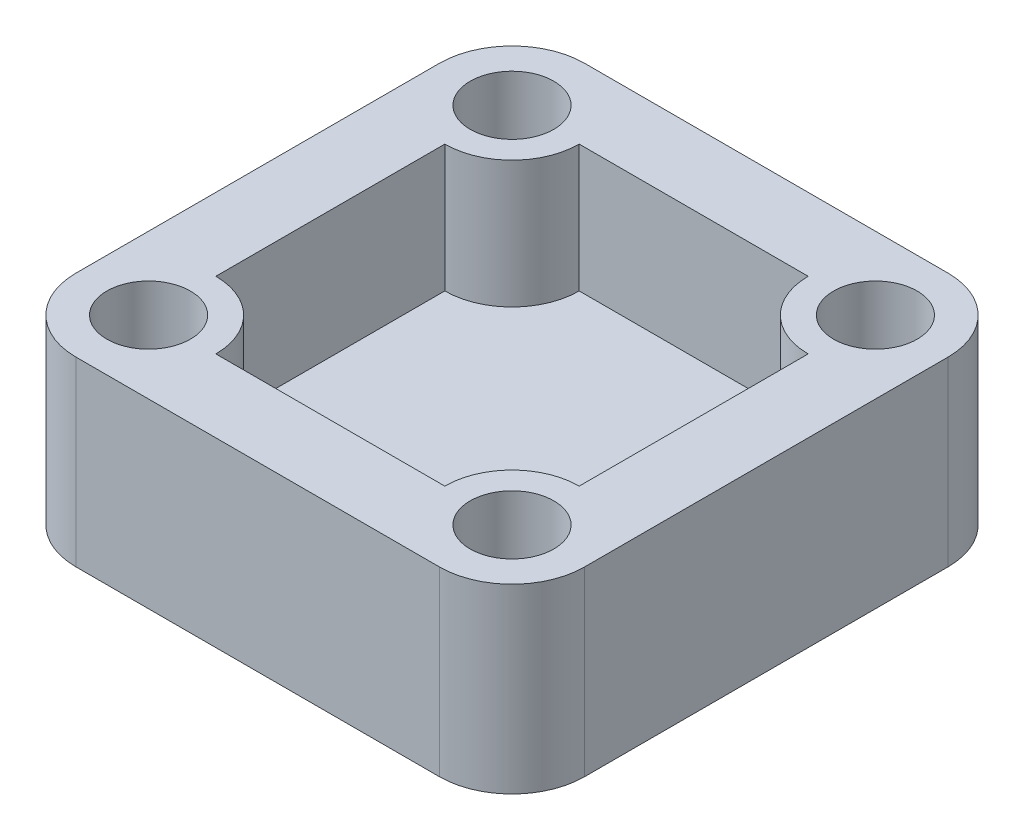
ISO-10303-21;
HEADER;
FILE_DESCRIPTION(('STEP AP214'),'2;1');
FILE_NAME('part.step','',(''),(''),'','','');
FILE_SCHEMA(('AUTOMOTIVE_DESIGN { 1 0 10303 214 1 1 1 1 }'));
ENDSEC;
DATA;
#1=APPLICATION_CONTEXT('core data for automotive mechanical design processes');
#2=APPLICATION_PROTOCOL_DEFINITION('international standard','automotive_design',2000,#1);
#3=PRODUCT_CONTEXT('',#1,'mechanical');
#4=PRODUCT('Part','Part','',(#3));
#5=PRODUCT_RELATED_PRODUCT_CATEGORY('part','',(#4));
#6=PRODUCT_DEFINITION_FORMATION('','',#4);
#7=PRODUCT_DEFINITION_CONTEXT('part definition',#1,'design');
#8=PRODUCT_DEFINITION('design','',#6,#7);
#9=PRODUCT_DEFINITION_SHAPE('','',#8);
#10=(LENGTH_UNIT() NAMED_UNIT(*) SI_UNIT(.MILLI.,.METRE.));
#11=(NAMED_UNIT(*) PLANE_ANGLE_UNIT() SI_UNIT($,.RADIAN.));
#12=(NAMED_UNIT(*) SI_UNIT($,.STERADIAN.) SOLID_ANGLE_UNIT());
#13=UNCERTAINTY_MEASURE_WITH_UNIT(LENGTH_MEASURE(1.E-05),#10,'distance_accuracy_value','');
#14=(GEOMETRIC_REPRESENTATION_CONTEXT(3) GLOBAL_UNCERTAINTY_ASSIGNED_CONTEXT((#13)) GLOBAL_UNIT_ASSIGNED_CONTEXT((#10,
#11,#12)) REPRESENTATION_CONTEXT('',''));
#15=CARTESIAN_POINT('',(0.,0.,0.));
#16=DIRECTION('',(0.,0.,1.));
#17=DIRECTION('',(1.,0.,0.));
#18=AXIS2_PLACEMENT_3D('',#15,#16,#17);
#19=CARTESIAN_POINT('',(-4.99999999999995,1.5,-5.00000000000005));
#20=DIRECTION('',(0.,-1.,0.));
#21=DIRECTION('',(0.,0.,-1.));
#22=AXIS2_PLACEMENT_3D('',#19,#20,#21);
#23=CYLINDRICAL_SURFACE('',#22,2.);
#24=CARTESIAN_POINT('',(-4.99999999999995,0.,-5.00000000000005));
#25=DIRECTION('',(0.,1.,0.));
#26=DIRECTION('',(0.,0.,-1.));
#27=AXIS2_PLACEMENT_3D('',#24,#25,#26);
#28=CIRCLE('',#27,2.);
#29=CARTESIAN_POINT('',(-4.99999999999992,0.,-7.00000000000005));
#30=VERTEX_POINT('',#29);
#31=CARTESIAN_POINT('',(-6.99999999999995,0.,-5.00000000000007));
#32=VERTEX_POINT('',#31);
#33=EDGE_CURVE('E247',#30,#32,#28,.T.);
#34=ORIENTED_EDGE('',*,*,#33,.T.);
#35=DIRECTION('',(0.,-1.,0.));
#36=VECTOR('',#35,1.);
#37=CARTESIAN_POINT('',(-6.99999999999995,1.5,-5.00000000000007));
#38=LINE('',#37,#36);
#39=CARTESIAN_POINT('',(-6.99999999999995,5.,-5.00000000000007));
#40=VERTEX_POINT('',#39);
#41=EDGE_CURVE('E44',#40,#32,#38,.T.);
#42=ORIENTED_EDGE('',*,*,#41,.F.);
#43=CARTESIAN_POINT('',(-4.99999999999995,5.,-5.00000000000005));
#44=DIRECTION('',(0.,1.,0.));
#45=DIRECTION('',(0.,0.,-1.));
#46=AXIS2_PLACEMENT_3D('',#43,#44,#45);
#47=CIRCLE('',#46,2.);
#48=CARTESIAN_POINT('',(-4.99999999999992,5.,-7.00000000000005));
#49=VERTEX_POINT('',#48);
#50=EDGE_CURVE('E229',#49,#40,#47,.T.);
#51=ORIENTED_EDGE('',*,*,#50,.F.);
#52=DIRECTION('',(0.,-1.,0.));
#53=VECTOR('',#52,1.);
#54=CARTESIAN_POINT('',(-4.99999999999992,1.5,-7.00000000000005));
#55=LINE('',#54,#53);
#56=EDGE_CURVE('E11',#49,#30,#55,.T.);
#57=ORIENTED_EDGE('',*,*,#56,.T.);
#58=EDGE_LOOP('',(#34,#42,#51,#57));
#59=FACE_BOUND('',#58,.T.);
#60=ADVANCED_FACE('F37',(#59),#23,.T.);
#61=CARTESIAN_POINT('',(-7.,1.5,0.));
#62=DIRECTION('',(1.,0.,0.));
#63=DIRECTION('',(0.,0.,-1.));
#64=AXIS2_PLACEMENT_3D('',#61,#62,#63);
#65=PLANE('',#64);
#66=DIRECTION('',(0.,0.,1.));
#67=VECTOR('',#66,1.);
#68=CARTESIAN_POINT('',(-7.,0.,0.));
#69=LINE('',#68,#67);
#70=CARTESIAN_POINT('',(-7.00000000000003,0.,4.99999999999995));
#71=VERTEX_POINT('',#70);
#72=EDGE_CURVE('E250',#32,#71,#69,.T.);
#73=ORIENTED_EDGE('',*,*,#72,.T.);
#74=DIRECTION('',(0.,-1.,0.));
#75=VECTOR('',#74,1.);
#76=CARTESIAN_POINT('',(-7.00000000000003,1.5,4.99999999999995));
#77=LINE('',#76,#75);
#78=CARTESIAN_POINT('',(-7.00000000000003,5.,4.99999999999995));
#79=VERTEX_POINT('',#78);
#80=EDGE_CURVE('E278',#79,#71,#77,.T.);
#81=ORIENTED_EDGE('',*,*,#80,.F.);
#82=DIRECTION('',(0.,0.,1.));
#83=VECTOR('',#82,1.);
#84=CARTESIAN_POINT('',(-7.,5.,0.));
#85=LINE('',#84,#83);
#86=EDGE_CURVE('E232',#40,#79,#85,.T.);
#87=ORIENTED_EDGE('',*,*,#86,.F.);
#88=ORIENTED_EDGE('',*,*,#41,.T.);
#89=EDGE_LOOP('',(#73,#81,#87,#88));
#90=FACE_BOUND('',#89,.T.);
#91=ADVANCED_FACE('F283',(#90),#65,.F.);
#92=CARTESIAN_POINT('',(-5.00000000000003,1.5,4.99999999999996));
#93=DIRECTION('',(0.,-1.,0.));
#94=DIRECTION('',(0.,0.,-1.));
#95=AXIS2_PLACEMENT_3D('',#92,#93,#94);
#96=CYLINDRICAL_SURFACE('',#95,2.);
#97=CARTESIAN_POINT('',(-5.00000000000003,0.,4.99999999999996));
#98=DIRECTION('',(0.,1.,0.));
#99=DIRECTION('',(0.,0.,-1.));
#100=AXIS2_PLACEMENT_3D('',#97,#98,#99);
#101=CIRCLE('',#100,2.);
#102=CARTESIAN_POINT('',(-5.00000000000004,0.,6.99999999999996));
#103=VERTEX_POINT('',#102);
#104=EDGE_CURVE('E252',#71,#103,#101,.T.);
#105=ORIENTED_EDGE('',*,*,#104,.T.);
#106=DIRECTION('',(0.,-1.,0.));
#107=VECTOR('',#106,1.);
#108=CARTESIAN_POINT('',(-5.00000000000004,1.5,6.99999999999996));
#109=LINE('',#108,#107);
#110=CARTESIAN_POINT('',(-5.00000000000004,5.,6.99999999999996));
#111=VERTEX_POINT('',#110);
#112=EDGE_CURVE('E275',#111,#103,#109,.T.);
#113=ORIENTED_EDGE('',*,*,#112,.F.);
#114=CARTESIAN_POINT('',(-5.00000000000003,5.,4.99999999999996));
#115=DIRECTION('',(0.,1.,0.));
#116=DIRECTION('',(0.,0.,-1.));
#117=AXIS2_PLACEMENT_3D('',#114,#115,#116);
#118=CIRCLE('',#117,2.);
#119=EDGE_CURVE('E235',#79,#111,#118,.T.);
#120=ORIENTED_EDGE('',*,*,#119,.F.);
#121=ORIENTED_EDGE('',*,*,#80,.T.);
#122=EDGE_LOOP('',(#105,#113,#120,#121));
#123=FACE_BOUND('',#122,.T.);
#124=ADVANCED_FACE('F299',(#123),#96,.T.);
#125=CARTESIAN_POINT('',(0.,1.5,7.));
#126=DIRECTION('',(0.,0.,-1.));
#127=DIRECTION('',(-1.,0.,0.));
#128=AXIS2_PLACEMENT_3D('',#125,#126,#127);
#129=PLANE('',#128);
#130=DIRECTION('',(1.,0.,0.));
#131=VECTOR('',#130,1.);
#132=CARTESIAN_POINT('',(0.,0.,7.));
#133=LINE('',#132,#131);
#134=CARTESIAN_POINT('',(4.99999999999997,0.,7.00000000000001));
#135=VERTEX_POINT('',#134);
#136=EDGE_CURVE('E255',#103,#135,#133,.T.);
#137=ORIENTED_EDGE('',*,*,#136,.T.);
#138=DIRECTION('',(0.,-1.,0.));
#139=VECTOR('',#138,1.);
#140=CARTESIAN_POINT('',(4.99999999999997,1.5,7.00000000000001));
#141=LINE('',#140,#139);
#142=CARTESIAN_POINT('',(4.99999999999997,5.,7.00000000000001));
#143=VERTEX_POINT('',#142);
#144=EDGE_CURVE('E272',#143,#135,#141,.T.);
#145=ORIENTED_EDGE('',*,*,#144,.F.);
#146=DIRECTION('',(1.,0.,0.));
#147=VECTOR('',#146,1.);
#148=CARTESIAN_POINT('',(0.,5.,7.));
#149=LINE('',#148,#147);
#150=EDGE_CURVE('E238',#111,#143,#149,.T.);
#151=ORIENTED_EDGE('',*,*,#150,.F.);
#152=ORIENTED_EDGE('',*,*,#112,.T.);
#153=EDGE_LOOP('',(#137,#145,#151,#152));
#154=FACE_BOUND('',#153,.T.);
#155=ADVANCED_FACE('F302',(#154),#129,.F.);
#156=CARTESIAN_POINT('',(4.99999999999998,1.5,5.00000000000001));
#157=DIRECTION('',(0.,-1.,0.));
#158=DIRECTION('',(0.,0.,-1.));
#159=AXIS2_PLACEMENT_3D('',#156,#157,#158);
#160=CYLINDRICAL_SURFACE('',#159,2.);
#161=CARTESIAN_POINT('',(4.99999999999998,0.,5.00000000000001));
#162=DIRECTION('',(0.,1.,0.));
#163=DIRECTION('',(0.,0.,-1.));
#164=AXIS2_PLACEMENT_3D('',#161,#162,#163);
#165=CIRCLE('',#164,2.);
#166=CARTESIAN_POINT('',(6.99999999999998,0.,5.00000000000002));
#167=VERTEX_POINT('',#166);
#168=EDGE_CURVE('E257',#135,#167,#165,.T.);
#169=ORIENTED_EDGE('',*,*,#168,.T.);
#170=DIRECTION('',(0.,-1.,0.));
#171=VECTOR('',#170,1.);
#172=CARTESIAN_POINT('',(6.99999999999998,1.5,5.00000000000002));
#173=LINE('',#172,#171);
#174=CARTESIAN_POINT('',(6.99999999999998,5.,5.00000000000002));
#175=VERTEX_POINT('',#174);
#176=EDGE_CURVE('E269',#175,#167,#173,.T.);
#177=ORIENTED_EDGE('',*,*,#176,.F.);
#178=CARTESIAN_POINT('',(4.99999999999998,5.,5.00000000000001));
#179=DIRECTION('',(0.,1.,0.));
#180=DIRECTION('',(0.,0.,-1.));
#181=AXIS2_PLACEMENT_3D('',#178,#179,#180);
#182=CIRCLE('',#181,2.);
#183=EDGE_CURVE('E241',#143,#175,#182,.T.);
#184=ORIENTED_EDGE('',*,*,#183,.F.);
#185=ORIENTED_EDGE('',*,*,#144,.T.);
#186=EDGE_LOOP('',(#169,#177,#184,#185));
#187=FACE_BOUND('',#186,.T.);
#188=ADVANCED_FACE('F306',(#187),#160,.T.);
#189=CARTESIAN_POINT('',(7.,1.5,0.));
#190=DIRECTION('',(-1.,0.,0.));
#191=DIRECTION('',(0.,0.,1.));
#192=AXIS2_PLACEMENT_3D('',#189,#190,#191);
#193=PLANE('',#192);
#194=DIRECTION('',(0.,0.,-1.));
#195=VECTOR('',#194,1.);
#196=CARTESIAN_POINT('',(7.,0.,0.));
#197=LINE('',#196,#195);
#198=CARTESIAN_POINT('',(7.,0.,-5.));
#199=VERTEX_POINT('',#198);
#200=EDGE_CURVE('E260',#167,#199,#197,.T.);
#201=ORIENTED_EDGE('',*,*,#200,.T.);
#202=DIRECTION('',(0.,-1.,0.));
#203=VECTOR('',#202,1.);
#204=CARTESIAN_POINT('',(7.,1.5,-5.));
#205=LINE('',#204,#203);
#206=CARTESIAN_POINT('',(7.,5.,-5.));
#207=VERTEX_POINT('',#206);
#208=EDGE_CURVE('E267',#207,#199,#205,.T.);
#209=ORIENTED_EDGE('',*,*,#208,.F.);
#210=DIRECTION('',(0.,0.,-1.));
#211=VECTOR('',#210,1.);
#212=CARTESIAN_POINT('',(7.,5.,0.));
#213=LINE('',#212,#211);
#214=EDGE_CURVE('E244',#175,#207,#213,.T.);
#215=ORIENTED_EDGE('',*,*,#214,.F.);
#216=ORIENTED_EDGE('',*,*,#176,.T.);
#217=EDGE_LOOP('',(#201,#209,#215,#216));
#218=FACE_BOUND('',#217,.T.);
#219=ADVANCED_FACE('F308',(#218),#193,.F.);
#220=CARTESIAN_POINT('',(5.,1.5,-5.));
#221=DIRECTION('',(0.,-1.,0.));
#222=DIRECTION('',(0.,0.,-1.));
#223=AXIS2_PLACEMENT_3D('',#220,#221,#222);
#224=CYLINDRICAL_SURFACE('',#223,2.);
#225=CARTESIAN_POINT('',(5.,0.,-5.));
#226=DIRECTION('',(0.,1.,0.));
#227=DIRECTION('',(0.,0.,-1.));
#228=AXIS2_PLACEMENT_3D('',#225,#226,#227);
#229=CIRCLE('',#228,2.);
#230=CARTESIAN_POINT('',(5.,0.,-7.));
#231=VERTEX_POINT('',#230);
#232=EDGE_CURVE('E59',#199,#231,#229,.T.);
#233=ORIENTED_EDGE('',*,*,#232,.T.);
#234=DIRECTION('',(0.,-1.,0.));
#235=VECTOR('',#234,1.);
#236=CARTESIAN_POINT('',(5.,1.5,-7.));
#237=LINE('',#236,#235);
#238=CARTESIAN_POINT('',(5.,5.,-7.));
#239=VERTEX_POINT('',#238);
#240=EDGE_CURVE('E265',#239,#231,#237,.T.);
#241=ORIENTED_EDGE('',*,*,#240,.F.);
#242=CARTESIAN_POINT('',(5.,5.,-5.));
#243=DIRECTION('',(0.,1.,0.));
#244=DIRECTION('',(0.,0.,-1.));
#245=AXIS2_PLACEMENT_3D('',#242,#243,#244);
#246=CIRCLE('',#245,2.);
#247=EDGE_CURVE('E166',#207,#239,#246,.T.);
#248=ORIENTED_EDGE('',*,*,#247,.F.);
#249=ORIENTED_EDGE('',*,*,#208,.T.);
#250=EDGE_LOOP('',(#233,#241,#248,#249));
#251=FACE_BOUND('',#250,.T.);
#252=ADVANCED_FACE('F309',(#251),#224,.T.);
#253=CARTESIAN_POINT('',(0.,1.5,-7.));
#254=DIRECTION('',(0.,0.,1.));
#255=DIRECTION('',(1.,0.,0.));
#256=AXIS2_PLACEMENT_3D('',#253,#254,#255);
#257=PLANE('',#256);
#258=DIRECTION('',(-1.,0.,0.));
#259=VECTOR('',#258,1.);
#260=CARTESIAN_POINT('',(0.,0.,-7.));
#261=LINE('',#260,#259);
#262=EDGE_CURVE('E263',#231,#30,#261,.T.);
#263=ORIENTED_EDGE('',*,*,#262,.T.);
#264=ORIENTED_EDGE('',*,*,#56,.F.);
#265=DIRECTION('',(-1.,0.,0.));
#266=VECTOR('',#265,1.);
#267=CARTESIAN_POINT('',(0.,5.,-7.));
#268=LINE('',#267,#266);
#269=EDGE_CURVE('E226',#239,#49,#268,.T.);
#270=ORIENTED_EDGE('',*,*,#269,.F.);
#271=ORIENTED_EDGE('',*,*,#240,.T.);
#272=EDGE_LOOP('',(#263,#264,#270,#271));
#273=FACE_BOUND('',#272,.T.);
#274=ADVANCED_FACE('F292',(#273),#257,.F.);
#275=CARTESIAN_POINT('',(-4.99999999999995,0.,-5.00000000000005));
#276=DIRECTION('',(0.,-1.,0.));
#277=DIRECTION('',(0.,0.,-1.));
#278=AXIS2_PLACEMENT_3D('',#275,#276,#277);
#279=PLANE('',#278);
#280=CARTESIAN_POINT('',(-5.,0.,-4.99999999999972));
#281=DIRECTION('',(0.,1.,0.));
#282=DIRECTION('',(0.,0.,1.));
#283=AXIS2_PLACEMENT_3D('',#280,#281,#282);
#284=CIRCLE('',#283,1.15);
#285=CARTESIAN_POINT('',(-5.,0.,-3.84999999999972));
#286=VERTEX_POINT('',#285);
#287=EDGE_CURVE('E507',#286,#286,#284,.T.);
#288=ORIENTED_EDGE('',*,*,#287,.T.);
#289=EDGE_LOOP('',(#288));
#290=FACE_BOUND('',#289,.T.);
#291=CARTESIAN_POINT('',(-4.99999999999972,0.,5.00000000000027));
#292=DIRECTION('',(0.,1.,0.));
#293=DIRECTION('',(0.,0.,1.));
#294=AXIS2_PLACEMENT_3D('',#291,#292,#293);
#295=CIRCLE('',#294,1.15);
#296=CARTESIAN_POINT('',(-4.99999999999972,0.,6.15000000000027));
#297=VERTEX_POINT('',#296);
#298=EDGE_CURVE('E515',#297,#297,#295,.T.);
#299=ORIENTED_EDGE('',*,*,#298,.T.);
#300=EDGE_LOOP('',(#299));
#301=FACE_BOUND('',#300,.T.);
#302=CARTESIAN_POINT('',(5.00000000000027,0.,4.99999999999999));
#303=DIRECTION('',(0.,1.,0.));
#304=DIRECTION('',(0.,0.,1.));
#305=AXIS2_PLACEMENT_3D('',#302,#303,#304);
#306=CIRCLE('',#305,1.15);
#307=CARTESIAN_POINT('',(5.00000000000027,0.,6.15));
#308=VERTEX_POINT('',#307);
#309=EDGE_CURVE('E521',#308,#308,#306,.T.);
#310=ORIENTED_EDGE('',*,*,#309,.T.);
#311=EDGE_LOOP('',(#310));
#312=FACE_BOUND('',#311,.T.);
#313=CARTESIAN_POINT('',(5.,0.,-5.));
#314=DIRECTION('',(0.,1.,0.));
#315=DIRECTION('',(0.,0.,1.));
#316=AXIS2_PLACEMENT_3D('',#313,#314,#315);
#317=CIRCLE('',#316,1.15);
#318=CARTESIAN_POINT('',(5.,0.,-3.85));
#319=VERTEX_POINT('',#318);
#320=EDGE_CURVE('E190',#319,#319,#317,.T.);
#321=ORIENTED_EDGE('',*,*,#320,.T.);
#322=EDGE_LOOP('',(#321));
#323=FACE_BOUND('',#322,.T.);
#324=ORIENTED_EDGE('',*,*,#33,.F.);
#325=ORIENTED_EDGE('',*,*,#262,.F.);
#326=ORIENTED_EDGE('',*,*,#232,.F.);
#327=ORIENTED_EDGE('',*,*,#200,.F.);
#328=ORIENTED_EDGE('',*,*,#168,.F.);
#329=ORIENTED_EDGE('',*,*,#136,.F.);
#330=ORIENTED_EDGE('',*,*,#104,.F.);
#331=ORIENTED_EDGE('',*,*,#72,.F.);
#332=EDGE_LOOP('',(#324,#325,#326,#327,#328,#329,#330,#331));
#333=FACE_BOUND('',#332,.T.);
#334=ADVANCED_FACE('F295',(#290,#301,#312,#323,#333),#279,.T.);
#335=CARTESIAN_POINT('',(5.,5.,-5.));
#336=DIRECTION('',(0.,-1.,0.));
#337=DIRECTION('',(0.,0.,-1.));
#338=AXIS2_PLACEMENT_3D('',#335,#336,#337);
#339=PLANE('',#338);
#340=CARTESIAN_POINT('',(-5.,5.,-4.99999999999972));
#341=DIRECTION('',(0.,1.,0.));
#342=DIRECTION('',(0.,0.,1.));
#343=AXIS2_PLACEMENT_3D('',#340,#341,#342);
#344=CIRCLE('',#343,1.15);
#345=CARTESIAN_POINT('',(-5.,5.,-3.84999999999972));
#346=VERTEX_POINT('',#345);
#347=EDGE_CURVE('E510',#346,#346,#344,.T.);
#348=ORIENTED_EDGE('',*,*,#347,.F.);
#349=EDGE_LOOP('',(#348));
#350=FACE_BOUND('',#349,.T.);
#351=CARTESIAN_POINT('',(-4.99999999999972,5.,5.00000000000027));
#352=DIRECTION('',(0.,1.,0.));
#353=DIRECTION('',(0.,0.,1.));
#354=AXIS2_PLACEMENT_3D('',#351,#352,#353);
#355=CIRCLE('',#354,1.15);
#356=CARTESIAN_POINT('',(-4.99999999999972,5.,6.15000000000027));
#357=VERTEX_POINT('',#356);
#358=EDGE_CURVE('E512',#357,#357,#355,.T.);
#359=ORIENTED_EDGE('',*,*,#358,.F.);
#360=EDGE_LOOP('',(#359));
#361=FACE_BOUND('',#360,.T.);
#362=CARTESIAN_POINT('',(5.00000000000027,5.,4.99999999999999));
#363=DIRECTION('',(0.,1.,0.));
#364=DIRECTION('',(0.,0.,1.));
#365=AXIS2_PLACEMENT_3D('',#362,#363,#364);
#366=CIRCLE('',#365,1.15);
#367=CARTESIAN_POINT('',(5.00000000000027,5.,6.15));
#368=VERTEX_POINT('',#367);
#369=EDGE_CURVE('E518',#368,#368,#366,.T.);
#370=ORIENTED_EDGE('',*,*,#369,.F.);
#371=EDGE_LOOP('',(#370));
#372=FACE_BOUND('',#371,.T.);
#373=CARTESIAN_POINT('',(5.,5.,-5.));
#374=DIRECTION('',(0.,1.,0.));
#375=DIRECTION('',(0.,0.,1.));
#376=AXIS2_PLACEMENT_3D('',#373,#374,#375);
#377=CIRCLE('',#376,1.15);
#378=CARTESIAN_POINT('',(5.,5.,-3.85));
#379=VERTEX_POINT('',#378);
#380=EDGE_CURVE('E524',#379,#379,#377,.T.);
#381=ORIENTED_EDGE('',*,*,#380,.F.);
#382=EDGE_LOOP('',(#381));
#383=FACE_BOUND('',#382,.T.);
#384=ORIENTED_EDGE('',*,*,#247,.T.);
#385=ORIENTED_EDGE('',*,*,#269,.T.);
#386=ORIENTED_EDGE('',*,*,#50,.T.);
#387=ORIENTED_EDGE('',*,*,#86,.T.);
#388=ORIENTED_EDGE('',*,*,#119,.T.);
#389=ORIENTED_EDGE('',*,*,#150,.T.);
#390=ORIENTED_EDGE('',*,*,#183,.T.);
#391=ORIENTED_EDGE('',*,*,#214,.T.);
#392=EDGE_LOOP('',(#384,#385,#386,#387,#388,#389,#390,#391));
#393=FACE_BOUND('',#392,.T.);
#394=CARTESIAN_POINT('',(5.,5.,-5.));
#395=DIRECTION('',(0.,-1.,0.));
#396=DIRECTION('',(0.,0.,1.));
#397=AXIS2_PLACEMENT_3D('',#394,#395,#396);
#398=CIRCLE('',#397,1.85);
#399=CARTESIAN_POINT('',(5.,5.,-3.15));
#400=VERTEX_POINT('',#399);
#401=CARTESIAN_POINT('',(3.14999999999999,5.,-5.));
#402=VERTEX_POINT('',#401);
#403=EDGE_CURVE('E150',#400,#402,#398,.T.);
#404=ORIENTED_EDGE('',*,*,#403,.F.);
#405=DIRECTION('',(0.,0.,-1.));
#406=VECTOR('',#405,1.);
#407=CARTESIAN_POINT('',(5.,5.,0.));
#408=LINE('',#407,#406);
#409=CARTESIAN_POINT('',(5.,5.,3.15000000000002));
#410=VERTEX_POINT('',#409);
#411=EDGE_CURVE('E186',#410,#400,#408,.T.);
#412=ORIENTED_EDGE('',*,*,#411,.F.);
#413=CARTESIAN_POINT('',(4.99999999999998,5.,5.00000000000001));
#414=DIRECTION('',(0.,-1.,0.));
#415=DIRECTION('',(0.,0.,1.));
#416=AXIS2_PLACEMENT_3D('',#413,#414,#415);
#417=CIRCLE('',#416,1.85);
#418=CARTESIAN_POINT('',(3.15,5.,5.));
#419=VERTEX_POINT('',#418);
#420=EDGE_CURVE('E183',#419,#410,#417,.T.);
#421=ORIENTED_EDGE('',*,*,#420,.F.);
#422=DIRECTION('',(1.,0.,0.));
#423=VECTOR('',#422,1.);
#424=CARTESIAN_POINT('',(0.,5.,5.));
#425=LINE('',#424,#423);
#426=CARTESIAN_POINT('',(-3.15000000000004,5.,5.));
#427=VERTEX_POINT('',#426);
#428=EDGE_CURVE('E181',#427,#419,#425,.T.);
#429=ORIENTED_EDGE('',*,*,#428,.F.);
#430=CARTESIAN_POINT('',(-5.00000000000003,5.,4.99999999999996));
#431=DIRECTION('',(0.,-1.,0.));
#432=DIRECTION('',(0.,0.,1.));
#433=AXIS2_PLACEMENT_3D('',#430,#431,#432);
#434=CIRCLE('',#433,1.84999999999999);
#435=CARTESIAN_POINT('',(-5.,5.,3.15000000000001));
#436=VERTEX_POINT('',#435);
#437=EDGE_CURVE('E179',#436,#427,#434,.T.);
#438=ORIENTED_EDGE('',*,*,#437,.F.);
#439=DIRECTION('',(0.,0.,1.));
#440=VECTOR('',#439,1.);
#441=CARTESIAN_POINT('',(-5.,5.,0.));
#442=LINE('',#441,#440);
#443=CARTESIAN_POINT('',(-5.,5.,-3.15000000000005));
#444=VERTEX_POINT('',#443);
#445=EDGE_CURVE('E174',#444,#436,#442,.T.);
#446=ORIENTED_EDGE('',*,*,#445,.F.);
#447=CARTESIAN_POINT('',(-4.99999999999995,5.,-5.00000000000005));
#448=DIRECTION('',(0.,-1.,0.));
#449=DIRECTION('',(0.,0.,1.));
#450=AXIS2_PLACEMENT_3D('',#447,#448,#449);
#451=CIRCLE('',#450,1.84999999999999);
#452=CARTESIAN_POINT('',(-3.15000000000001,5.,-5.));
#453=VERTEX_POINT('',#452);
#454=EDGE_CURVE('E172',#453,#444,#451,.T.);
#455=ORIENTED_EDGE('',*,*,#454,.F.);
#456=DIRECTION('',(-1.,0.,0.));
#457=VECTOR('',#456,1.);
#458=CARTESIAN_POINT('',(0.,5.,-5.));
#459=LINE('',#458,#457);
#460=EDGE_CURVE('E158',#402,#453,#459,.T.);
#461=ORIENTED_EDGE('',*,*,#460,.F.);
#462=EDGE_LOOP('',(#404,#412,#421,#429,#438,#446,#455,#461));
#463=FACE_BOUND('',#462,.T.);
#464=ADVANCED_FACE('F170',(#350,#361,#372,#383,#393,#463),#339,.F.);
#465=CARTESIAN_POINT('',(5.,5.,-5.));
#466=DIRECTION('',(0.,-1.,0.));
#467=DIRECTION('',(0.,0.,-1.));
#468=AXIS2_PLACEMENT_3D('',#465,#466,#467);
#469=CYLINDRICAL_SURFACE('',#468,1.85);
#470=CARTESIAN_POINT('',(5.,1.5,-5.));
#471=DIRECTION('',(0.,-1.,0.));
#472=DIRECTION('',(0.,0.,1.));
#473=AXIS2_PLACEMENT_3D('',#470,#471,#472);
#474=CIRCLE('',#473,1.85);
#475=CARTESIAN_POINT('',(5.,1.5,-3.15));
#476=VERTEX_POINT('',#475);
#477=CARTESIAN_POINT('',(3.14999999999999,1.5,-5.));
#478=VERTEX_POINT('',#477);
#479=EDGE_CURVE('E188',#476,#478,#474,.T.);
#480=ORIENTED_EDGE('',*,*,#479,.F.);
#481=DIRECTION('',(0.,-1.,0.));
#482=VECTOR('',#481,1.);
#483=CARTESIAN_POINT('',(5.,5.,-3.15));
#484=LINE('',#483,#482);
#485=EDGE_CURVE('E51',#400,#476,#484,.T.);
#486=ORIENTED_EDGE('',*,*,#485,.F.);
#487=ORIENTED_EDGE('',*,*,#403,.T.);
#488=DIRECTION('',(0.,-1.,0.));
#489=VECTOR('',#488,1.);
#490=CARTESIAN_POINT('',(3.14999999999999,5.,-5.));
#491=LINE('',#490,#489);
#492=EDGE_CURVE('E153',#402,#478,#491,.T.);
#493=ORIENTED_EDGE('',*,*,#492,.T.);
#494=EDGE_LOOP('',(#480,#486,#487,#493));
#495=FACE_BOUND('',#494,.T.);
#496=ADVANCED_FACE('F152',(#495),#469,.T.);
#497=CARTESIAN_POINT('',(-3.15000000000001,5.,-5.));
#498=DIRECTION('',(0.,0.,1.));
#499=DIRECTION('',(1.,0.,0.));
#500=AXIS2_PLACEMENT_3D('',#497,#498,#499);
#501=PLANE('',#500);
#502=DIRECTION('',(-1.,0.,0.));
#503=VECTOR('',#502,1.);
#504=CARTESIAN_POINT('',(-3.15000000000001,1.5,-5.));
#505=LINE('',#504,#503);
#506=CARTESIAN_POINT('',(-3.15000000000001,1.5,-5.));
#507=VERTEX_POINT('',#506);
#508=EDGE_CURVE('E165',#478,#507,#505,.T.);
#509=ORIENTED_EDGE('',*,*,#508,.F.);
#510=ORIENTED_EDGE('',*,*,#492,.F.);
#511=ORIENTED_EDGE('',*,*,#460,.T.);
#512=DIRECTION('',(0.,-1.,0.));
#513=VECTOR('',#512,1.);
#514=CARTESIAN_POINT('',(-3.15000000000001,5.,-5.));
#515=LINE('',#514,#513);
#516=EDGE_CURVE('E167',#453,#507,#515,.T.);
#517=ORIENTED_EDGE('',*,*,#516,.T.);
#518=EDGE_LOOP('',(#509,#510,#511,#517));
#519=FACE_BOUND('',#518,.T.);
#520=ADVANCED_FACE('F162',(#519),#501,.T.);
#521=CARTESIAN_POINT('',(-4.99999999999995,5.,-5.00000000000005));
#522=DIRECTION('',(0.,-1.,0.));
#523=DIRECTION('',(0.,0.,-1.));
#524=AXIS2_PLACEMENT_3D('',#521,#522,#523);
#525=CYLINDRICAL_SURFACE('',#524,1.84999999999999);
#526=CARTESIAN_POINT('',(-4.99999999999995,1.5,-5.00000000000005));
#527=DIRECTION('',(0.,-1.,0.));
#528=DIRECTION('',(0.,0.,1.));
#529=AXIS2_PLACEMENT_3D('',#526,#527,#528);
#530=CIRCLE('',#529,1.84999999999999);
#531=CARTESIAN_POINT('',(-5.,1.5,-3.15000000000005));
#532=VERTEX_POINT('',#531);
#533=EDGE_CURVE('E192',#507,#532,#530,.T.);
#534=ORIENTED_EDGE('',*,*,#533,.F.);
#535=ORIENTED_EDGE('',*,*,#516,.F.);
#536=ORIENTED_EDGE('',*,*,#454,.T.);
#537=DIRECTION('',(0.,-1.,0.));
#538=VECTOR('',#537,1.);
#539=CARTESIAN_POINT('',(-5.,5.,-3.15000000000005));
#540=LINE('',#539,#538);
#541=EDGE_CURVE('E220',#444,#532,#540,.T.);
#542=ORIENTED_EDGE('',*,*,#541,.T.);
#543=EDGE_LOOP('',(#534,#535,#536,#542));
#544=FACE_BOUND('',#543,.T.);
#545=ADVANCED_FACE('F372',(#544),#525,.T.);
#546=CARTESIAN_POINT('',(-5.,5.,3.15000000000001));
#547=DIRECTION('',(1.,0.,0.));
#548=DIRECTION('',(0.,0.,-1.));
#549=AXIS2_PLACEMENT_3D('',#546,#547,#548);
#550=PLANE('',#549);
#551=DIRECTION('',(0.,0.,1.));
#552=VECTOR('',#551,1.);
#553=CARTESIAN_POINT('',(-5.,1.5,3.15000000000001));
#554=LINE('',#553,#552);
#555=CARTESIAN_POINT('',(-5.,1.5,3.15000000000001));
#556=VERTEX_POINT('',#555);
#557=EDGE_CURVE('E195',#532,#556,#554,.T.);
#558=ORIENTED_EDGE('',*,*,#557,.F.);
#559=ORIENTED_EDGE('',*,*,#541,.F.);
#560=ORIENTED_EDGE('',*,*,#445,.T.);
#561=DIRECTION('',(0.,-1.,0.));
#562=VECTOR('',#561,1.);
#563=CARTESIAN_POINT('',(-5.,5.,3.15000000000001));
#564=LINE('',#563,#562);
#565=EDGE_CURVE('E218',#436,#556,#564,.T.);
#566=ORIENTED_EDGE('',*,*,#565,.T.);
#567=EDGE_LOOP('',(#558,#559,#560,#566));
#568=FACE_BOUND('',#567,.T.);
#569=ADVANCED_FACE('F381',(#568),#550,.T.);
#570=CARTESIAN_POINT('',(-5.00000000000003,5.,4.99999999999996));
#571=DIRECTION('',(0.,-1.,0.));
#572=DIRECTION('',(0.,0.,-1.));
#573=AXIS2_PLACEMENT_3D('',#570,#571,#572);
#574=CYLINDRICAL_SURFACE('',#573,1.84999999999999);
#575=CARTESIAN_POINT('',(-5.00000000000003,1.5,4.99999999999996));
#576=DIRECTION('',(0.,-1.,0.));
#577=DIRECTION('',(0.,0.,1.));
#578=AXIS2_PLACEMENT_3D('',#575,#576,#577);
#579=CIRCLE('',#578,1.84999999999999);
#580=CARTESIAN_POINT('',(-3.15000000000004,1.5,5.));
#581=VERTEX_POINT('',#580);
#582=EDGE_CURVE('E198',#556,#581,#579,.T.);
#583=ORIENTED_EDGE('',*,*,#582,.F.);
#584=ORIENTED_EDGE('',*,*,#565,.F.);
#585=ORIENTED_EDGE('',*,*,#437,.T.);
#586=DIRECTION('',(0.,-1.,0.));
#587=VECTOR('',#586,1.);
#588=CARTESIAN_POINT('',(-3.15000000000004,5.,5.));
#589=LINE('',#588,#587);
#590=EDGE_CURVE('E215',#427,#581,#589,.T.);
#591=ORIENTED_EDGE('',*,*,#590,.T.);
#592=EDGE_LOOP('',(#583,#584,#585,#591));
#593=FACE_BOUND('',#592,.T.);
#594=ADVANCED_FACE('F392',(#593),#574,.T.);
#595=CARTESIAN_POINT('',(3.15,5.,5.));
#596=DIRECTION('',(0.,0.,-1.));
#597=DIRECTION('',(-1.,0.,0.));
#598=AXIS2_PLACEMENT_3D('',#595,#596,#597);
#599=PLANE('',#598);
#600=DIRECTION('',(1.,0.,0.));
#601=VECTOR('',#600,1.);
#602=CARTESIAN_POINT('',(3.15,1.5,5.));
#603=LINE('',#602,#601);
#604=CARTESIAN_POINT('',(3.15,1.5,5.));
#605=VERTEX_POINT('',#604);
#606=EDGE_CURVE('E201',#581,#605,#603,.T.);
#607=ORIENTED_EDGE('',*,*,#606,.F.);
#608=ORIENTED_EDGE('',*,*,#590,.F.);
#609=ORIENTED_EDGE('',*,*,#428,.T.);
#610=DIRECTION('',(0.,-1.,0.));
#611=VECTOR('',#610,1.);
#612=CARTESIAN_POINT('',(3.15,5.,5.));
#613=LINE('',#612,#611);
#614=EDGE_CURVE('E213',#419,#605,#613,.T.);
#615=ORIENTED_EDGE('',*,*,#614,.T.);
#616=EDGE_LOOP('',(#607,#608,#609,#615));
#617=FACE_BOUND('',#616,.T.);
#618=ADVANCED_FACE('F402',(#617),#599,.T.);
#619=CARTESIAN_POINT('',(4.99999999999998,5.,5.00000000000001));
#620=DIRECTION('',(0.,-1.,0.));
#621=DIRECTION('',(0.,0.,-1.));
#622=AXIS2_PLACEMENT_3D('',#619,#620,#621);
#623=CYLINDRICAL_SURFACE('',#622,1.85);
#624=CARTESIAN_POINT('',(4.99999999999998,1.5,5.00000000000001));
#625=DIRECTION('',(0.,-1.,0.));
#626=DIRECTION('',(0.,0.,1.));
#627=AXIS2_PLACEMENT_3D('',#624,#625,#626);
#628=CIRCLE('',#627,1.85);
#629=CARTESIAN_POINT('',(4.99999999999999,1.5,3.15000000000002));
#630=VERTEX_POINT('',#629);
#631=EDGE_CURVE('E204',#605,#630,#628,.T.);
#632=ORIENTED_EDGE('',*,*,#631,.F.);
#633=ORIENTED_EDGE('',*,*,#614,.F.);
#634=ORIENTED_EDGE('',*,*,#420,.T.);
#635=DIRECTION('',(0.,-1.,0.));
#636=VECTOR('',#635,1.);
#637=CARTESIAN_POINT('',(4.99999999999999,5.,3.15000000000002));
#638=LINE('',#637,#636);
#639=EDGE_CURVE('E210',#410,#630,#638,.T.);
#640=ORIENTED_EDGE('',*,*,#639,.T.);
#641=EDGE_LOOP('',(#632,#633,#634,#640));
#642=FACE_BOUND('',#641,.T.);
#643=ADVANCED_FACE('F413',(#642),#623,.T.);
#644=CARTESIAN_POINT('',(5.,5.,-3.15));
#645=DIRECTION('',(-1.,0.,0.));
#646=DIRECTION('',(0.,0.,1.));
#647=AXIS2_PLACEMENT_3D('',#644,#645,#646);
#648=PLANE('',#647);
#649=DIRECTION('',(0.,0.,-1.));
#650=VECTOR('',#649,1.);
#651=CARTESIAN_POINT('',(5.,1.5,-3.15));
#652=LINE('',#651,#650);
#653=EDGE_CURVE('E159',#630,#476,#652,.T.);
#654=ORIENTED_EDGE('',*,*,#653,.F.);
#655=ORIENTED_EDGE('',*,*,#639,.F.);
#656=ORIENTED_EDGE('',*,*,#411,.T.);
#657=ORIENTED_EDGE('',*,*,#485,.T.);
#658=EDGE_LOOP('',(#654,#655,#656,#657));
#659=FACE_BOUND('',#658,.T.);
#660=ADVANCED_FACE('F423',(#659),#648,.T.);
#661=CARTESIAN_POINT('',(-4.99999999999995,1.5,-5.00000000000005));
#662=DIRECTION('',(0.,-1.,0.));
#663=DIRECTION('',(0.,0.,-1.));
#664=AXIS2_PLACEMENT_3D('',#661,#662,#663);
#665=PLANE('',#664);
#666=ORIENTED_EDGE('',*,*,#653,.T.);
#667=ORIENTED_EDGE('',*,*,#479,.T.);
#668=ORIENTED_EDGE('',*,*,#508,.T.);
#669=ORIENTED_EDGE('',*,*,#533,.T.);
#670=ORIENTED_EDGE('',*,*,#557,.T.);
#671=ORIENTED_EDGE('',*,*,#582,.T.);
#672=ORIENTED_EDGE('',*,*,#606,.T.);
#673=ORIENTED_EDGE('',*,*,#631,.T.);
#674=EDGE_LOOP('',(#666,#667,#668,#669,#670,#671,#672,#673));
#675=FACE_BOUND('',#674,.T.);
#676=ADVANCED_FACE('F434',(#675),#665,.F.);
#677=CARTESIAN_POINT('',(5.,0.,-5.));
#678=DIRECTION('',(0.,1.,0.));
#679=DIRECTION('',(0.,0.,1.));
#680=AXIS2_PLACEMENT_3D('',#677,#678,#679);
#681=CYLINDRICAL_SURFACE('',#680,1.15);
#682=ORIENTED_EDGE('',*,*,#320,.F.);
#683=EDGE_LOOP('',(#682));
#684=FACE_BOUND('',#683,.T.);
#685=ORIENTED_EDGE('',*,*,#380,.T.);
#686=EDGE_LOOP('',(#685));
#687=FACE_BOUND('',#686,.T.);
#688=ADVANCED_FACE('F444',(#684,#687),#681,.F.);
#689=CARTESIAN_POINT('',(5.00000000000027,0.,4.99999999999999));
#690=DIRECTION('',(0.,1.,0.));
#691=DIRECTION('',(0.,0.,1.));
#692=AXIS2_PLACEMENT_3D('',#689,#690,#691);
#693=CYLINDRICAL_SURFACE('',#692,1.15);
#694=ORIENTED_EDGE('',*,*,#309,.F.);
#695=EDGE_LOOP('',(#694));
#696=FACE_BOUND('',#695,.T.);
#697=ORIENTED_EDGE('',*,*,#369,.T.);
#698=EDGE_LOOP('',(#697));
#699=FACE_BOUND('',#698,.T.);
#700=ADVANCED_FACE('F470',(#696,#699),#693,.F.);
#701=CARTESIAN_POINT('',(-4.99999999999972,0.,5.00000000000027));
#702=DIRECTION('',(0.,1.,0.));
#703=DIRECTION('',(0.,0.,1.));
#704=AXIS2_PLACEMENT_3D('',#701,#702,#703);
#705=CYLINDRICAL_SURFACE('',#704,1.15);
#706=ORIENTED_EDGE('',*,*,#298,.F.);
#707=EDGE_LOOP('',(#706));
#708=FACE_BOUND('',#707,.T.);
#709=ORIENTED_EDGE('',*,*,#358,.T.);
#710=EDGE_LOOP('',(#709));
#711=FACE_BOUND('',#710,.T.);
#712=ADVANCED_FACE('F480',(#708,#711),#705,.F.);
#713=CARTESIAN_POINT('',(-5.,0.,-4.99999999999972));
#714=DIRECTION('',(0.,1.,0.));
#715=DIRECTION('',(0.,0.,1.));
#716=AXIS2_PLACEMENT_3D('',#713,#714,#715);
#717=CYLINDRICAL_SURFACE('',#716,1.15);
#718=ORIENTED_EDGE('',*,*,#287,.F.);
#719=EDGE_LOOP('',(#718));
#720=FACE_BOUND('',#719,.T.);
#721=ORIENTED_EDGE('',*,*,#347,.T.);
#722=EDGE_LOOP('',(#721));
#723=FACE_BOUND('',#722,.T.);
#724=ADVANCED_FACE('F490',(#720,#723),#717,.F.);
#725=CLOSED_SHELL('',(#60,#91,#124,#155,#188,#219,#252,#274,#334,#464,#496,#520,#545,#569,#594,
#618,#643,#660,#676,#688,#700,#712,#724));
#726=MANIFOLD_SOLID_BREP('B2',#725);
#727=ADVANCED_BREP_SHAPE_REPRESENTATION('',(#18,#726),#14);
#728=SHAPE_DEFINITION_REPRESENTATION(#9,#727);
ENDSEC;
END-ISO-10303-21;
